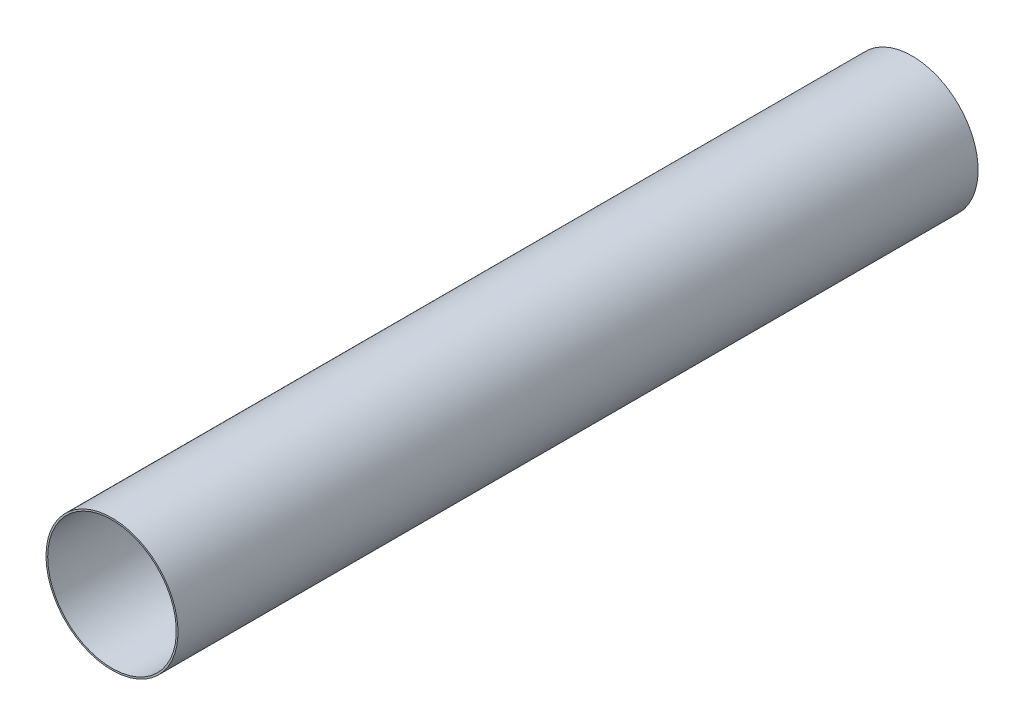
ISO-10303-21;
HEADER;
FILE_DESCRIPTION(('STEP AP214'),'2;1');
FILE_NAME('part.step','',(''),(''),'','','');
FILE_SCHEMA(('AUTOMOTIVE_DESIGN { 1 0 10303 214 1 1 1 1 }'));
ENDSEC;
DATA;
#1=APPLICATION_CONTEXT('core data for automotive mechanical design processes');
#2=APPLICATION_PROTOCOL_DEFINITION('international standard','automotive_design',2000,#1);
#3=PRODUCT_CONTEXT('',#1,'mechanical');
#4=PRODUCT('Part','Part','',(#3));
#5=PRODUCT_RELATED_PRODUCT_CATEGORY('part','',(#4));
#6=PRODUCT_DEFINITION_FORMATION('','',#4);
#7=PRODUCT_DEFINITION_CONTEXT('part definition',#1,'design');
#8=PRODUCT_DEFINITION('design','',#6,#7);
#9=PRODUCT_DEFINITION_SHAPE('','',#8);
#10=(LENGTH_UNIT() NAMED_UNIT(*) SI_UNIT(.MILLI.,.METRE.));
#11=(NAMED_UNIT(*) PLANE_ANGLE_UNIT() SI_UNIT($,.RADIAN.));
#12=(NAMED_UNIT(*) SI_UNIT($,.STERADIAN.) SOLID_ANGLE_UNIT());
#13=UNCERTAINTY_MEASURE_WITH_UNIT(LENGTH_MEASURE(1.E-05),#10,'distance_accuracy_value','');
#14=(GEOMETRIC_REPRESENTATION_CONTEXT(3) GLOBAL_UNCERTAINTY_ASSIGNED_CONTEXT((#13)) GLOBAL_UNIT_ASSIGNED_CONTEXT((#10,
#11,#12)) REPRESENTATION_CONTEXT('',''));
#15=CARTESIAN_POINT('',(0.,0.,0.));
#16=DIRECTION('',(0.,0.,1.));
#17=DIRECTION('',(1.,0.,0.));
#18=AXIS2_PLACEMENT_3D('',#15,#16,#17);
#19=CARTESIAN_POINT('',(0.,0.,950.));
#20=DIRECTION('',(0.,0.,1.));
#21=DIRECTION('',(1.,0.,0.));
#22=AXIS2_PLACEMENT_3D('',#19,#20,#21);
#23=PLANE('',#22);
#24=CARTESIAN_POINT('',(0.,0.,950.));
#25=DIRECTION('',(0.,0.,1.));
#26=DIRECTION('',(1.,0.,0.));
#27=AXIS2_PLACEMENT_3D('',#24,#25,#26);
#28=CIRCLE('',#27,78.35);
#29=CARTESIAN_POINT('',(-78.35,0.,950.));
#30=VERTEX_POINT('',#29);
#31=EDGE_CURVE('E10',#30,#30,#28,.T.);
#32=ORIENTED_EDGE('',*,*,#31,.T.);
#33=EDGE_LOOP('',(#32));
#34=FACE_BOUND('',#33,.T.);
#35=CARTESIAN_POINT('',(0.,0.,950.));
#36=DIRECTION('',(0.,0.,1.));
#37=DIRECTION('',(1.,0.,0.));
#38=AXIS2_PLACEMENT_3D('',#35,#36,#37);
#39=CIRCLE('',#38,76.35);
#40=CARTESIAN_POINT('',(-76.35,0.,950.));
#41=VERTEX_POINT('',#40);
#42=EDGE_CURVE('E42',#41,#41,#39,.T.);
#43=ORIENTED_EDGE('',*,*,#42,.F.);
#44=EDGE_LOOP('',(#43));
#45=FACE_BOUND('',#44,.T.);
#46=ADVANCED_FACE('F31',(#34,#45),#23,.T.);
#47=CARTESIAN_POINT('',(0.,0.,0.));
#48=DIRECTION('',(0.,0.,1.));
#49=DIRECTION('',(1.,0.,0.));
#50=AXIS2_PLACEMENT_3D('',#47,#48,#49);
#51=PLANE('',#50);
#52=CARTESIAN_POINT('',(0.,0.,0.));
#53=DIRECTION('',(0.,0.,1.));
#54=DIRECTION('',(1.,0.,0.));
#55=AXIS2_PLACEMENT_3D('',#52,#53,#54);
#56=CIRCLE('',#55,78.35);
#57=CARTESIAN_POINT('',(-78.35,0.,-1.11022302462516E-13));
#58=VERTEX_POINT('',#57);
#59=EDGE_CURVE('E35',#58,#58,#56,.T.);
#60=ORIENTED_EDGE('',*,*,#59,.F.);
#61=EDGE_LOOP('',(#60));
#62=FACE_BOUND('',#61,.T.);
#63=CARTESIAN_POINT('',(0.,0.,0.));
#64=DIRECTION('',(0.,0.,1.));
#65=DIRECTION('',(1.,0.,0.));
#66=AXIS2_PLACEMENT_3D('',#63,#64,#65);
#67=CIRCLE('',#66,76.35);
#68=CARTESIAN_POINT('',(-76.35,0.,-1.11022302462516E-13));
#69=VERTEX_POINT('',#68);
#70=EDGE_CURVE('E44',#69,#69,#67,.T.);
#71=ORIENTED_EDGE('',*,*,#70,.T.);
#72=EDGE_LOOP('',(#71));
#73=FACE_BOUND('',#72,.T.);
#74=ADVANCED_FACE('F54',(#62,#73),#51,.F.);
#75=CARTESIAN_POINT('',(0.,0.,950.));
#76=DIRECTION('',(0.,0.,-1.));
#77=DIRECTION('',(-1.,0.,0.));
#78=AXIS2_PLACEMENT_3D('',#75,#76,#77);
#79=CYLINDRICAL_SURFACE('',#78,78.35);
#80=CARTESIAN_POINT('',(-78.35,0.,950.));
#81=CARTESIAN_POINT('',(-78.35,0.,940.104166666667));
#82=CARTESIAN_POINT('',(-78.35,0.,930.208333333333));
#83=CARTESIAN_POINT('',(-78.35,0.,910.416666666667));
#84=CARTESIAN_POINT('',(-78.35,0.,900.520833333333));
#85=CARTESIAN_POINT('',(-78.35,0.,880.729166666667));
#86=CARTESIAN_POINT('',(-78.35,0.,870.833333333333));
#87=CARTESIAN_POINT('',(-78.35,0.,851.041666666667));
#88=CARTESIAN_POINT('',(-78.35,0.,841.145833333333));
#89=CARTESIAN_POINT('',(-78.35,0.,821.354166666667));
#90=CARTESIAN_POINT('',(-78.35,0.,811.458333333333));
#91=CARTESIAN_POINT('',(-78.35,0.,791.666666666667));
#92=CARTESIAN_POINT('',(-78.35,0.,781.770833333333));
#93=CARTESIAN_POINT('',(-78.35,0.,761.979166666667));
#94=CARTESIAN_POINT('',(-78.35,0.,752.083333333333));
#95=CARTESIAN_POINT('',(-78.35,0.,732.291666666667));
#96=CARTESIAN_POINT('',(-78.35,0.,722.395833333333));
#97=CARTESIAN_POINT('',(-78.35,0.,702.604166666667));
#98=CARTESIAN_POINT('',(-78.35,0.,692.708333333333));
#99=CARTESIAN_POINT('',(-78.35,0.,672.916666666667));
#100=CARTESIAN_POINT('',(-78.35,0.,663.020833333333));
#101=CARTESIAN_POINT('',(-78.35,0.,643.229166666667));
#102=CARTESIAN_POINT('',(-78.35,0.,633.333333333333));
#103=CARTESIAN_POINT('',(-78.35,0.,613.541666666667));
#104=CARTESIAN_POINT('',(-78.35,0.,603.645833333333));
#105=CARTESIAN_POINT('',(-78.35,0.,583.854166666667));
#106=CARTESIAN_POINT('',(-78.35,0.,573.958333333333));
#107=CARTESIAN_POINT('',(-78.35,0.,554.166666666667));
#108=CARTESIAN_POINT('',(-78.35,0.,544.270833333333));
#109=CARTESIAN_POINT('',(-78.35,0.,524.479166666667));
#110=CARTESIAN_POINT('',(-78.35,0.,514.583333333333));
#111=CARTESIAN_POINT('',(-78.35,0.,494.791666666667));
#112=CARTESIAN_POINT('',(-78.35,0.,484.895833333333));
#113=CARTESIAN_POINT('',(-78.35,0.,465.104166666667));
#114=CARTESIAN_POINT('',(-78.35,0.,455.208333333333));
#115=CARTESIAN_POINT('',(-78.35,0.,435.416666666667));
#116=CARTESIAN_POINT('',(-78.35,0.,425.520833333333));
#117=CARTESIAN_POINT('',(-78.35,0.,405.729166666667));
#118=CARTESIAN_POINT('',(-78.35,0.,395.833333333333));
#119=CARTESIAN_POINT('',(-78.35,0.,376.041666666667));
#120=CARTESIAN_POINT('',(-78.35,0.,366.145833333333));
#121=CARTESIAN_POINT('',(-78.35,0.,346.354166666667));
#122=CARTESIAN_POINT('',(-78.35,0.,336.458333333333));
#123=CARTESIAN_POINT('',(-78.35,0.,316.666666666667));
#124=CARTESIAN_POINT('',(-78.35,0.,306.770833333333));
#125=CARTESIAN_POINT('',(-78.35,0.,286.979166666667));
#126=CARTESIAN_POINT('',(-78.35,0.,277.083333333333));
#127=CARTESIAN_POINT('',(-78.35,0.,257.291666666667));
#128=CARTESIAN_POINT('',(-78.35,0.,247.395833333333));
#129=CARTESIAN_POINT('',(-78.35,0.,227.604166666667));
#130=CARTESIAN_POINT('',(-78.35,0.,217.708333333333));
#131=CARTESIAN_POINT('',(-78.35,0.,197.916666666667));
#132=CARTESIAN_POINT('',(-78.35,0.,188.020833333333));
#133=CARTESIAN_POINT('',(-78.35,0.,168.229166666667));
#134=CARTESIAN_POINT('',(-78.35,0.,158.333333333333));
#135=CARTESIAN_POINT('',(-78.35,0.,138.541666666667));
#136=CARTESIAN_POINT('',(-78.35,0.,128.645833333333));
#137=CARTESIAN_POINT('',(-78.35,0.,108.854166666667));
#138=CARTESIAN_POINT('',(-78.35,0.,98.9583333333333));
#139=CARTESIAN_POINT('',(-78.35,0.,79.1666666666666));
#140=CARTESIAN_POINT('',(-78.35,0.,69.2708333333332));
#141=CARTESIAN_POINT('',(-78.35,0.,49.4791666666665));
#142=CARTESIAN_POINT('',(-78.35,0.,39.5833333333332));
#143=CARTESIAN_POINT('',(-78.35,0.,19.7916666666665));
#144=CARTESIAN_POINT('',(-78.35,0.,9.89583333333321));
#145=CARTESIAN_POINT('',(-78.35,0.,-1.11022302462516E-13));
#146=B_SPLINE_CURVE_WITH_KNOTS('',3,(#80,#81,#82,#83,#84,#85,#86,#87,#88,#89,#90,#91,#92,#93,
#94,#95,#96,#97,#98,#99,#100,#101,#102,#103,#104,#105,#106,#107,#108,#109,#110,#111,#112,#113,
#114,#115,#116,#117,#118,#119,#120,#121,#122,#123,#124,#125,#126,#127,#128,#129,#130,#131,#132,
#133,#134,#135,#136,#137,#138,#139,#140,#141,#142,#143,#144,#145),.UNSPECIFIED.,.F.,.F.,(4,2,2,
2,2,2,2,2,2,2,2,2,2,2,2,2,2,2,2,2,2,2,2,2,2,2,2,2,2,2,2,2,4),(0.,29.6875,59.375,
89.0624999999999,118.75,148.4375,178.125,207.8125,237.5,267.1875,296.875,326.5625,356.25,
385.9375,415.625,445.3125,475.,504.6875,534.375,564.0625,593.75,623.4375,653.125,682.8125,712.5,
742.1875,771.875,801.5625,831.25,860.9375,890.625,920.3125,950.),.UNSPECIFIED.);
#147=EDGE_CURVE('BSEAM33',#30,#58,#146,.T.);
#148=ORIENTED_EDGE('',*,*,#31,.F.);
#149=ORIENTED_EDGE('',*,*,#59,.T.);
#150=ORIENTED_EDGE('',*,*,#147,.T.);
#151=ORIENTED_EDGE('',*,*,#147,.F.);
#152=EDGE_LOOP('',(#148,#150,#149,#151));
#153=FACE_BOUND('',#152,.T.);
#154=ADVANCED_FACE('F33',(#153),#79,.T.);
#155=CARTESIAN_POINT('',(0.,0.,950.));
#156=DIRECTION('',(0.,0.,-1.));
#157=DIRECTION('',(-1.,0.,0.));
#158=AXIS2_PLACEMENT_3D('',#155,#156,#157);
#159=CYLINDRICAL_SURFACE('',#158,76.35);
#160=CARTESIAN_POINT('',(-76.35,0.,950.));
#161=CARTESIAN_POINT('',(-76.35,0.,940.104166666667));
#162=CARTESIAN_POINT('',(-76.35,0.,930.208333333333));
#163=CARTESIAN_POINT('',(-76.35,0.,910.416666666667));
#164=CARTESIAN_POINT('',(-76.35,0.,900.520833333333));
#165=CARTESIAN_POINT('',(-76.35,0.,880.729166666667));
#166=CARTESIAN_POINT('',(-76.35,0.,870.833333333333));
#167=CARTESIAN_POINT('',(-76.35,0.,851.041666666667));
#168=CARTESIAN_POINT('',(-76.35,0.,841.145833333333));
#169=CARTESIAN_POINT('',(-76.35,0.,821.354166666667));
#170=CARTESIAN_POINT('',(-76.35,0.,811.458333333333));
#171=CARTESIAN_POINT('',(-76.35,0.,791.666666666667));
#172=CARTESIAN_POINT('',(-76.35,0.,781.770833333333));
#173=CARTESIAN_POINT('',(-76.35,0.,761.979166666667));
#174=CARTESIAN_POINT('',(-76.35,0.,752.083333333333));
#175=CARTESIAN_POINT('',(-76.35,0.,732.291666666667));
#176=CARTESIAN_POINT('',(-76.35,0.,722.395833333333));
#177=CARTESIAN_POINT('',(-76.35,0.,702.604166666667));
#178=CARTESIAN_POINT('',(-76.35,0.,692.708333333333));
#179=CARTESIAN_POINT('',(-76.35,0.,672.916666666667));
#180=CARTESIAN_POINT('',(-76.35,0.,663.020833333333));
#181=CARTESIAN_POINT('',(-76.35,0.,643.229166666667));
#182=CARTESIAN_POINT('',(-76.35,0.,633.333333333333));
#183=CARTESIAN_POINT('',(-76.35,0.,613.541666666667));
#184=CARTESIAN_POINT('',(-76.35,0.,603.645833333333));
#185=CARTESIAN_POINT('',(-76.35,0.,583.854166666667));
#186=CARTESIAN_POINT('',(-76.35,0.,573.958333333333));
#187=CARTESIAN_POINT('',(-76.35,0.,554.166666666667));
#188=CARTESIAN_POINT('',(-76.35,0.,544.270833333333));
#189=CARTESIAN_POINT('',(-76.35,0.,524.479166666667));
#190=CARTESIAN_POINT('',(-76.35,0.,514.583333333333));
#191=CARTESIAN_POINT('',(-76.35,0.,494.791666666667));
#192=CARTESIAN_POINT('',(-76.35,0.,484.895833333333));
#193=CARTESIAN_POINT('',(-76.35,0.,465.104166666667));
#194=CARTESIAN_POINT('',(-76.35,0.,455.208333333333));
#195=CARTESIAN_POINT('',(-76.35,0.,435.416666666667));
#196=CARTESIAN_POINT('',(-76.35,0.,425.520833333333));
#197=CARTESIAN_POINT('',(-76.35,0.,405.729166666667));
#198=CARTESIAN_POINT('',(-76.35,0.,395.833333333333));
#199=CARTESIAN_POINT('',(-76.35,0.,376.041666666667));
#200=CARTESIAN_POINT('',(-76.35,0.,366.145833333333));
#201=CARTESIAN_POINT('',(-76.35,0.,346.354166666667));
#202=CARTESIAN_POINT('',(-76.35,0.,336.458333333333));
#203=CARTESIAN_POINT('',(-76.35,0.,316.666666666667));
#204=CARTESIAN_POINT('',(-76.35,0.,306.770833333333));
#205=CARTESIAN_POINT('',(-76.35,0.,286.979166666667));
#206=CARTESIAN_POINT('',(-76.35,0.,277.083333333333));
#207=CARTESIAN_POINT('',(-76.35,0.,257.291666666667));
#208=CARTESIAN_POINT('',(-76.35,0.,247.395833333333));
#209=CARTESIAN_POINT('',(-76.35,0.,227.604166666667));
#210=CARTESIAN_POINT('',(-76.35,0.,217.708333333333));
#211=CARTESIAN_POINT('',(-76.35,0.,197.916666666667));
#212=CARTESIAN_POINT('',(-76.35,0.,188.020833333333));
#213=CARTESIAN_POINT('',(-76.35,0.,168.229166666667));
#214=CARTESIAN_POINT('',(-76.35,0.,158.333333333333));
#215=CARTESIAN_POINT('',(-76.35,0.,138.541666666667));
#216=CARTESIAN_POINT('',(-76.35,0.,128.645833333333));
#217=CARTESIAN_POINT('',(-76.35,0.,108.854166666667));
#218=CARTESIAN_POINT('',(-76.35,0.,98.9583333333333));
#219=CARTESIAN_POINT('',(-76.35,0.,79.1666666666666));
#220=CARTESIAN_POINT('',(-76.35,0.,69.2708333333332));
#221=CARTESIAN_POINT('',(-76.35,0.,49.4791666666665));
#222=CARTESIAN_POINT('',(-76.35,0.,39.5833333333332));
#223=CARTESIAN_POINT('',(-76.35,0.,19.7916666666665));
#224=CARTESIAN_POINT('',(-76.35,0.,9.89583333333321));
#225=CARTESIAN_POINT('',(-76.35,0.,-1.11022302462516E-13));
#226=B_SPLINE_CURVE_WITH_KNOTS('',3,(#160,#161,#162,#163,#164,#165,#166,#167,#168,#169,#170,
#171,#172,#173,#174,#175,#176,#177,#178,#179,#180,#181,#182,#183,#184,#185,#186,#187,#188,#189,
#190,#191,#192,#193,#194,#195,#196,#197,#198,#199,#200,#201,#202,#203,#204,#205,#206,#207,#208,
#209,#210,#211,#212,#213,#214,#215,#216,#217,#218,#219,#220,#221,#222,#223,#224,#225),
.UNSPECIFIED.,.F.,.F.,(4,2,2,2,2,2,2,2,2,2,2,2,2,2,2,2,2,2,2,2,2,2,2,2,2,2,2,2,2,2,2,2,4),(0.,
29.6875,59.375,89.0624999999999,118.75,148.4375,178.125,207.8125,237.5,267.1875,296.875,
326.5625,356.25,385.9375,415.625,445.3125,475.,504.6875,534.375,564.0625,593.75,623.4375,
653.125,682.8125,712.5,742.1875,771.875,801.5625,831.25,860.9375,890.625,920.3125,950.),.UNSPECIFIED.);
#227=EDGE_CURVE('BSEAM50',#41,#69,#226,.T.);
#228=ORIENTED_EDGE('',*,*,#42,.T.);
#229=ORIENTED_EDGE('',*,*,#70,.F.);
#230=ORIENTED_EDGE('',*,*,#227,.T.);
#231=ORIENTED_EDGE('',*,*,#227,.F.);
#232=EDGE_LOOP('',(#228,#230,#229,#231));
#233=FACE_BOUND('',#232,.T.);
#234=ADVANCED_FACE('F50',(#233),#159,.F.);
#235=CLOSED_SHELL('',(#46,#74,#154,#234));
#236=MANIFOLD_SOLID_BREP('B2',#235);
#237=ADVANCED_BREP_SHAPE_REPRESENTATION('',(#18,#236),#14);
#238=SHAPE_DEFINITION_REPRESENTATION(#9,#237);
ENDSEC;
END-ISO-10303-21;
